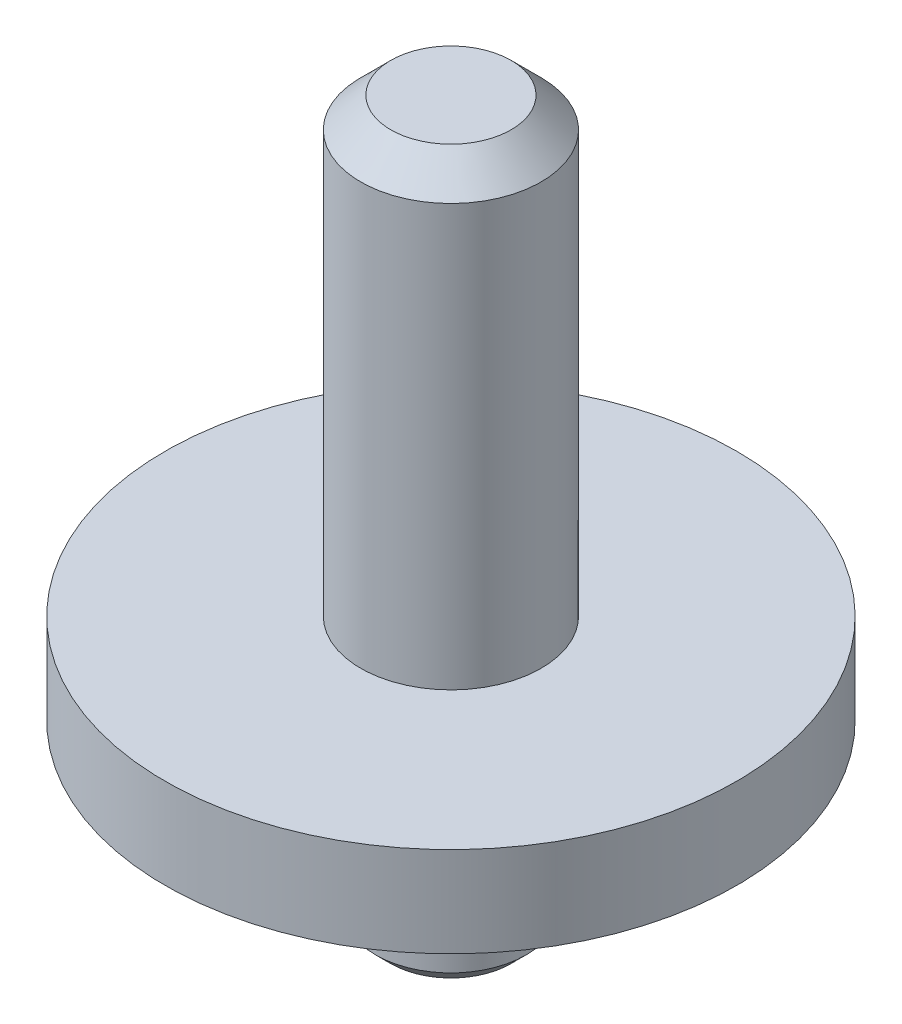
ISO-10303-21;
HEADER;
FILE_DESCRIPTION(('STEP AP214'),'2;1');
FILE_NAME('part.step','',(''),(''),'','','');
FILE_SCHEMA(('AUTOMOTIVE_DESIGN { 1 0 10303 214 1 1 1 1 }'));
ENDSEC;
DATA;
#1=APPLICATION_CONTEXT('core data for automotive mechanical design processes');
#2=APPLICATION_PROTOCOL_DEFINITION('international standard','automotive_design',2000,#1);
#3=PRODUCT_CONTEXT('',#1,'mechanical');
#4=PRODUCT('Part','Part','',(#3));
#5=PRODUCT_RELATED_PRODUCT_CATEGORY('part','',(#4));
#6=PRODUCT_DEFINITION_FORMATION('','',#4);
#7=PRODUCT_DEFINITION_CONTEXT('part definition',#1,'design');
#8=PRODUCT_DEFINITION('design','',#6,#7);
#9=PRODUCT_DEFINITION_SHAPE('','',#8);
#10=(LENGTH_UNIT() NAMED_UNIT(*) SI_UNIT(.MILLI.,.METRE.));
#11=(NAMED_UNIT(*) PLANE_ANGLE_UNIT() SI_UNIT($,.RADIAN.));
#12=(NAMED_UNIT(*) SI_UNIT($,.STERADIAN.) SOLID_ANGLE_UNIT());
#13=UNCERTAINTY_MEASURE_WITH_UNIT(LENGTH_MEASURE(1.E-05),#10,'distance_accuracy_value','');
#14=(GEOMETRIC_REPRESENTATION_CONTEXT(3) GLOBAL_UNCERTAINTY_ASSIGNED_CONTEXT((#13)) GLOBAL_UNIT_ASSIGNED_CONTEXT((#10,
#11,#12)) REPRESENTATION_CONTEXT('',''));
#15=CARTESIAN_POINT('',(0.,0.,0.));
#16=DIRECTION('',(0.,0.,1.));
#17=DIRECTION('',(1.,0.,0.));
#18=AXIS2_PLACEMENT_3D('',#15,#16,#17);
#19=CARTESIAN_POINT('',(0.,41.7259730069115,0.));
#20=DIRECTION('',(0.,-1.,0.));
#21=DIRECTION('',(0.,0.,-1.));
#22=AXIS2_PLACEMENT_3D('',#19,#20,#21);
#23=PLANE('',#22);
#24=CARTESIAN_POINT('',(0.,41.7259730069115,0.));
#25=DIRECTION('',(0.,-1.,0.));
#26=DIRECTION('',(0.,0.,-1.));
#27=AXIS2_PLACEMENT_3D('',#24,#25,#26);
#28=CIRCLE('',#27,4.);
#29=CARTESIAN_POINT('',(0.,41.7259730069115,-4.00000000000001));
#30=VERTEX_POINT('',#29);
#31=EDGE_CURVE('E10',#30,#30,#28,.F.);
#32=ORIENTED_EDGE('',*,*,#31,.T.);
#33=EDGE_LOOP('',(#32));
#34=FACE_BOUND('',#33,.T.);
#35=ADVANCED_FACE('F30',(#34),#23,.F.);
#36=CARTESIAN_POINT('',(0.,0.,0.));
#37=DIRECTION('',(0.,-1.,0.));
#38=DIRECTION('',(0.,0.,-1.));
#39=AXIS2_PLACEMENT_3D('',#36,#37,#38);
#40=CYLINDRICAL_SURFACE('',#39,6.);
#41=CARTESIAN_POINT('',(0.,39.7259730069115,0.));
#42=DIRECTION('',(0.,-1.,0.));
#43=DIRECTION('',(0.,0.,-1.));
#44=AXIS2_PLACEMENT_3D('',#41,#42,#43);
#45=CIRCLE('',#44,6.);
#46=CARTESIAN_POINT('',(0.,39.7259730069115,-6.));
#47=VERTEX_POINT('',#46);
#48=EDGE_CURVE('E36',#47,#47,#45,.T.);
#49=ORIENTED_EDGE('',*,*,#48,.T.);
#50=EDGE_LOOP('',(#49));
#51=FACE_BOUND('',#50,.T.);
#52=CARTESIAN_POINT('',(0.,11.7259730069115,0.));
#53=DIRECTION('',(0.,-1.,0.));
#54=DIRECTION('',(0.,0.,-1.));
#55=AXIS2_PLACEMENT_3D('',#52,#53,#54);
#56=CIRCLE('',#55,6.);
#57=CARTESIAN_POINT('',(0.,11.7259730069115,-6.));
#58=VERTEX_POINT('',#57);
#59=EDGE_CURVE('E49',#58,#58,#56,.T.);
#60=ORIENTED_EDGE('',*,*,#59,.F.);
#61=EDGE_LOOP('',(#60));
#62=FACE_BOUND('',#61,.T.);
#63=ADVANCED_FACE('F97',(#51,#62),#40,.T.);
#64=CARTESIAN_POINT('',(-6.,11.7259730069115,0.));
#65=DIRECTION('',(0.,-1.,0.));
#66=DIRECTION('',(0.,0.,-1.));
#67=AXIS2_PLACEMENT_3D('',#64,#65,#66);
#68=PLANE('',#67);
#69=CARTESIAN_POINT('',(0.,11.7259730069115,0.));
#70=DIRECTION('',(0.,-1.,0.));
#71=DIRECTION('',(0.,0.,-1.));
#72=AXIS2_PLACEMENT_3D('',#69,#70,#71);
#73=CIRCLE('',#72,19.);
#74=CARTESIAN_POINT('',(0.,11.7259730069115,-19.));
#75=VERTEX_POINT('',#74);
#76=EDGE_CURVE('E52',#75,#75,#73,.T.);
#77=ORIENTED_EDGE('',*,*,#76,.F.);
#78=EDGE_LOOP('',(#77));
#79=FACE_BOUND('',#78,.T.);
#80=ORIENTED_EDGE('',*,*,#59,.T.);
#81=EDGE_LOOP('',(#80));
#82=FACE_BOUND('',#81,.T.);
#83=ADVANCED_FACE('F91',(#79,#82),#68,.F.);
#84=CARTESIAN_POINT('',(0.,0.,0.));
#85=DIRECTION('',(0.,-1.,0.));
#86=DIRECTION('',(0.,0.,-1.));
#87=AXIS2_PLACEMENT_3D('',#84,#85,#86);
#88=CYLINDRICAL_SURFACE('',#87,19.);
#89=CARTESIAN_POINT('',(0.,5.72597300691151,0.));
#90=DIRECTION('',(0.,-1.,0.));
#91=DIRECTION('',(0.,0.,-1.));
#92=AXIS2_PLACEMENT_3D('',#89,#90,#91);
#93=CIRCLE('',#92,19.);
#94=CARTESIAN_POINT('',(0.,5.72597300691151,-19.));
#95=VERTEX_POINT('',#94);
#96=EDGE_CURVE('E55',#95,#95,#93,.T.);
#97=ORIENTED_EDGE('',*,*,#96,.F.);
#98=EDGE_LOOP('',(#97));
#99=FACE_BOUND('',#98,.T.);
#100=ORIENTED_EDGE('',*,*,#76,.T.);
#101=EDGE_LOOP('',(#100));
#102=FACE_BOUND('',#101,.T.);
#103=ADVANCED_FACE('F85',(#99,#102),#88,.T.);
#104=CARTESIAN_POINT('',(-19.,5.72597300691151,0.));
#105=DIRECTION('',(0.,1.,0.));
#106=DIRECTION('',(0.,0.,1.));
#107=AXIS2_PLACEMENT_3D('',#104,#105,#106);
#108=PLANE('',#107);
#109=CARTESIAN_POINT('',(0.,5.72597300691151,0.));
#110=DIRECTION('',(0.,-1.,0.));
#111=DIRECTION('',(0.,0.,-1.));
#112=AXIS2_PLACEMENT_3D('',#109,#110,#111);
#113=CIRCLE('',#112,15.);
#114=CARTESIAN_POINT('',(0.,5.72597300691151,-15.));
#115=VERTEX_POINT('',#114);
#116=EDGE_CURVE('E58',#115,#115,#113,.T.);
#117=ORIENTED_EDGE('',*,*,#116,.F.);
#118=EDGE_LOOP('',(#117));
#119=FACE_BOUND('',#118,.T.);
#120=ORIENTED_EDGE('',*,*,#96,.T.);
#121=EDGE_LOOP('',(#120));
#122=FACE_BOUND('',#121,.T.);
#123=ADVANCED_FACE('F79',(#119,#122),#108,.F.);
#124=CARTESIAN_POINT('',(0.,0.,0.));
#125=DIRECTION('',(0.,-1.,0.));
#126=DIRECTION('',(0.,0.,-1.));
#127=AXIS2_PLACEMENT_3D('',#124,#125,#126);
#128=CYLINDRICAL_SURFACE('',#127,15.);
#129=CARTESIAN_POINT('',(0.,8.7259730069115,0.));
#130=DIRECTION('',(0.,-1.,0.));
#131=DIRECTION('',(0.,0.,-1.));
#132=AXIS2_PLACEMENT_3D('',#129,#130,#131);
#133=CIRCLE('',#132,15.);
#134=CARTESIAN_POINT('',(0.,8.7259730069115,-15.));
#135=VERTEX_POINT('',#134);
#136=EDGE_CURVE('E61',#135,#135,#133,.T.);
#137=ORIENTED_EDGE('',*,*,#136,.F.);
#138=EDGE_LOOP('',(#137));
#139=FACE_BOUND('',#138,.T.);
#140=ORIENTED_EDGE('',*,*,#116,.T.);
#141=EDGE_LOOP('',(#140));
#142=FACE_BOUND('',#141,.T.);
#143=ADVANCED_FACE('F73',(#139,#142),#128,.F.);
#144=CARTESIAN_POINT('',(-15.,8.7259730069115,0.));
#145=DIRECTION('',(0.,1.,0.));
#146=DIRECTION('',(0.,0.,1.));
#147=AXIS2_PLACEMENT_3D('',#144,#145,#146);
#148=PLANE('',#147);
#149=CARTESIAN_POINT('',(0.,8.7259730069115,0.));
#150=DIRECTION('',(0.,-1.,0.));
#151=DIRECTION('',(0.,0.,-1.));
#152=AXIS2_PLACEMENT_3D('',#149,#150,#151);
#153=CIRCLE('',#152,5.);
#154=CARTESIAN_POINT('',(0.,8.7259730069115,-5.));
#155=VERTEX_POINT('',#154);
#156=EDGE_CURVE('E64',#155,#155,#153,.T.);
#157=ORIENTED_EDGE('',*,*,#156,.F.);
#158=EDGE_LOOP('',(#157));
#159=FACE_BOUND('',#158,.T.);
#160=ORIENTED_EDGE('',*,*,#136,.T.);
#161=EDGE_LOOP('',(#160));
#162=FACE_BOUND('',#161,.T.);
#163=ADVANCED_FACE('F70',(#159,#162),#148,.F.);
#164=CARTESIAN_POINT('',(0.,0.,0.));
#165=DIRECTION('',(0.,-1.,0.));
#166=DIRECTION('',(0.,0.,-1.));
#167=AXIS2_PLACEMENT_3D('',#164,#165,#166);
#168=CYLINDRICAL_SURFACE('',#167,5.);
#169=CARTESIAN_POINT('',(0.,-5.27402699308849,0.));
#170=DIRECTION('',(0.,1.,0.));
#171=DIRECTION('',(0.,0.,1.));
#172=AXIS2_PLACEMENT_3D('',#169,#170,#171);
#173=CIRCLE('',#172,5.);
#174=CARTESIAN_POINT('',(0.,-5.27402699308849,5.));
#175=VERTEX_POINT('',#174);
#176=EDGE_CURVE('E40',#175,#175,#173,.T.);
#177=ORIENTED_EDGE('',*,*,#176,.T.);
#178=EDGE_LOOP('',(#177));
#179=FACE_BOUND('',#178,.T.);
#180=ORIENTED_EDGE('',*,*,#156,.T.);
#181=EDGE_LOOP('',(#180));
#182=FACE_BOUND('',#181,.T.);
#183=ADVANCED_FACE('F68',(#179,#182),#168,.T.);
#184=CARTESIAN_POINT('',(-5.,-6.2740269930885,0.));
#185=DIRECTION('',(0.,1.,0.));
#186=DIRECTION('',(0.,0.,1.));
#187=AXIS2_PLACEMENT_3D('',#184,#185,#186);
#188=PLANE('',#187);
#189=CARTESIAN_POINT('',(0.,-6.2740269930885,0.));
#190=DIRECTION('',(0.,1.,0.));
#191=DIRECTION('',(0.,0.,1.));
#192=AXIS2_PLACEMENT_3D('',#189,#190,#191);
#193=CIRCLE('',#192,4.);
#194=CARTESIAN_POINT('',(0.,-6.2740269930885,4.));
#195=VERTEX_POINT('',#194);
#196=EDGE_CURVE('E44',#195,#195,#193,.F.);
#197=ORIENTED_EDGE('',*,*,#196,.T.);
#198=EDGE_LOOP('',(#197));
#199=FACE_BOUND('',#198,.T.);
#200=ADVANCED_FACE('F108',(#199),#188,.F.);
#201=CARTESIAN_POINT('',(0.,-6.2740269930885,0.));
#202=DIRECTION('',(0.,1.,0.));
#203=DIRECTION('',(0.,0.,1.));
#204=AXIS2_PLACEMENT_3D('',#201,#202,#203);
#205=CONICAL_SURFACE('',#204,4.,0.785398163397447);
#206=ORIENTED_EDGE('',*,*,#176,.F.);
#207=EDGE_LOOP('',(#206));
#208=FACE_BOUND('',#207,.T.);
#209=ORIENTED_EDGE('',*,*,#196,.F.);
#210=EDGE_LOOP('',(#209));
#211=FACE_BOUND('',#210,.T.);
#212=ADVANCED_FACE('F112',(#208,#211),#205,.T.);
#213=CARTESIAN_POINT('',(0.,39.7259730069115,0.));
#214=DIRECTION('',(0.,-1.,0.));
#215=DIRECTION('',(0.,0.,-1.));
#216=AXIS2_PLACEMENT_3D('',#213,#214,#215);
#217=CONICAL_SURFACE('',#216,6.,0.78539816339745);
#218=ORIENTED_EDGE('',*,*,#31,.F.);
#219=EDGE_LOOP('',(#218));
#220=FACE_BOUND('',#219,.T.);
#221=ORIENTED_EDGE('',*,*,#48,.F.);
#222=EDGE_LOOP('',(#221));
#223=FACE_BOUND('',#222,.T.);
#224=ADVANCED_FACE('F116',(#220,#223),#217,.T.);
#225=CLOSED_SHELL('',(#35,#63,#83,#103,#123,#143,#163,#183,#200,#212,#224));
#226=MANIFOLD_SOLID_BREP('B2',#225);
#227=ADVANCED_BREP_SHAPE_REPRESENTATION('',(#18,#226),#14);
#228=SHAPE_DEFINITION_REPRESENTATION(#9,#227);
ENDSEC;
END-ISO-10303-21;
